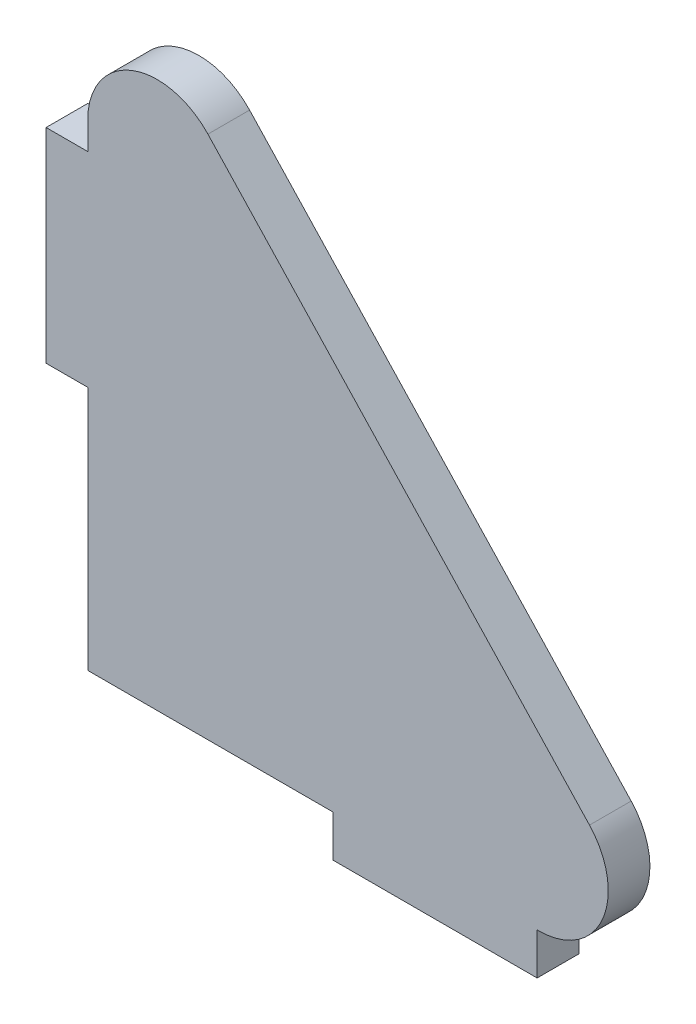
ISO-10303-21;
HEADER;
FILE_DESCRIPTION(('STEP AP214'),'2;1');
FILE_NAME('part.step','',(''),(''),'','','');
FILE_SCHEMA(('AUTOMOTIVE_DESIGN { 1 0 10303 214 1 1 1 1 }'));
ENDSEC;
DATA;
#1=APPLICATION_CONTEXT('core data for automotive mechanical design processes');
#2=APPLICATION_PROTOCOL_DEFINITION('international standard','automotive_design',2000,#1);
#3=PRODUCT_CONTEXT('',#1,'mechanical');
#4=PRODUCT('Part','Part','',(#3));
#5=PRODUCT_RELATED_PRODUCT_CATEGORY('part','',(#4));
#6=PRODUCT_DEFINITION_FORMATION('','',#4);
#7=PRODUCT_DEFINITION_CONTEXT('part definition',#1,'design');
#8=PRODUCT_DEFINITION('design','',#6,#7);
#9=PRODUCT_DEFINITION_SHAPE('','',#8);
#10=(LENGTH_UNIT() NAMED_UNIT(*) SI_UNIT(.MILLI.,.METRE.));
#11=(NAMED_UNIT(*) PLANE_ANGLE_UNIT() SI_UNIT($,.RADIAN.));
#12=(NAMED_UNIT(*) SI_UNIT($,.STERADIAN.) SOLID_ANGLE_UNIT());
#13=UNCERTAINTY_MEASURE_WITH_UNIT(LENGTH_MEASURE(1.E-05),#10,'distance_accuracy_value','');
#14=(GEOMETRIC_REPRESENTATION_CONTEXT(3) GLOBAL_UNCERTAINTY_ASSIGNED_CONTEXT((#13)) GLOBAL_UNIT_ASSIGNED_CONTEXT((#10,
#11,#12)) REPRESENTATION_CONTEXT('',''));
#15=CARTESIAN_POINT('',(0.,0.,0.));
#16=DIRECTION('',(0.,0.,1.));
#17=DIRECTION('',(1.,0.,0.));
#18=AXIS2_PLACEMENT_3D('',#15,#16,#17);
#19=CARTESIAN_POINT('',(3.0847778029221,2.88787709209728,3.));
#20=DIRECTION('',(-0.730021398632119,-0.683424288081133,0.));
#21=DIRECTION('',(0.683424288081133,-0.73002139863212,0.));
#22=AXIS2_PLACEMENT_3D('',#19,#20,#21);
#23=PLANE('',#22);
#24=DIRECTION('',(-0.683424288081134,0.73002139863212,0.));
#25=VECTOR('',#24,1.);
#26=CARTESIAN_POINT('',(3.0847778029221,2.88787709209728,0.));
#27=LINE('',#26,#25);
#28=CARTESIAN_POINT('',(26.0128648989864,-21.6034886696078,0.));
#29=VERTEX_POINT('',#28);
#30=CARTESIAN_POINT('',(-1.45716973811151,7.739502874565,0.));
#31=VERTEX_POINT('',#30);
#32=EDGE_CURVE('E174',#29,#31,#27,.T.);
#33=ORIENTED_EDGE('',*,*,#32,.T.);
#34=DIRECTION('',(0.,0.,-1.));
#35=VECTOR('',#34,1.);
#36=CARTESIAN_POINT('',(-1.45716973811151,7.739502874565,3.));
#37=LINE('',#36,#35);
#38=CARTESIAN_POINT('',(-1.45716973811151,7.739502874565,3.));
#39=VERTEX_POINT('',#38);
#40=EDGE_CURVE('E54',#31,#39,#37,.F.);
#41=ORIENTED_EDGE('',*,*,#40,.T.);
#42=DIRECTION('',(-0.683424288081134,0.73002139863212,0.));
#43=VECTOR('',#42,1.);
#44=CARTESIAN_POINT('',(3.0847778029221,2.88787709209728,3.));
#45=LINE('',#44,#43);
#46=CARTESIAN_POINT('',(26.0128648989864,-21.6034886696078,3.));
#47=VERTEX_POINT('',#46);
#48=EDGE_CURVE('E140',#47,#39,#45,.T.);
#49=ORIENTED_EDGE('',*,*,#48,.F.);
#50=DIRECTION('',(0.,0.,-1.));
#51=VECTOR('',#50,1.);
#52=CARTESIAN_POINT('',(26.0128648989864,-21.6034886696078,3.));
#53=LINE('',#52,#51);
#54=EDGE_CURVE('E220',#47,#29,#53,.T.);
#55=ORIENTED_EDGE('',*,*,#54,.T.);
#56=EDGE_LOOP('',(#33,#41,#49,#55));
#57=FACE_BOUND('',#56,.T.);
#58=ADVANCED_FACE('F33',(#57),#23,.F.);
#59=CARTESIAN_POINT('',(-10.1072767312721,0.,3.));
#60=DIRECTION('',(1.,0.,0.));
#61=DIRECTION('',(0.,1.,0.));
#62=AXIS2_PLACEMENT_3D('',#59,#60,#61);
#63=PLANE('',#62);
#64=DIRECTION('',(0.,-1.,0.));
#65=VECTOR('',#64,1.);
#66=CARTESIAN_POINT('',(-10.1072767312721,0.,3.));
#67=LINE('',#66,#65);
#68=CARTESIAN_POINT('',(-10.1072767312721,4.32238143415934,3.));
#69=VERTEX_POINT('',#68);
#70=CARTESIAN_POINT('',(-10.1072767312721,2.32938988998656,3.));
#71=VERTEX_POINT('',#70);
#72=EDGE_CURVE('E129',#69,#71,#67,.T.);
#73=ORIENTED_EDGE('',*,*,#72,.F.);
#74=DIRECTION('',(0.,0.,-1.));
#75=VECTOR('',#74,1.);
#76=CARTESIAN_POINT('',(-10.1072767312721,4.32238143415934,3.));
#77=LINE('',#76,#75);
#78=CARTESIAN_POINT('',(-10.1072767312721,4.32238143415934,0.));
#79=VERTEX_POINT('',#78);
#80=EDGE_CURVE('E151',#69,#79,#77,.T.);
#81=ORIENTED_EDGE('',*,*,#80,.T.);
#82=DIRECTION('',(0.,-1.,0.));
#83=VECTOR('',#82,1.);
#84=CARTESIAN_POINT('',(-10.1072767312721,0.,0.));
#85=LINE('',#84,#83);
#86=CARTESIAN_POINT('',(-10.1072767312721,2.32938988998656,0.));
#87=VERTEX_POINT('',#86);
#88=EDGE_CURVE('E147',#79,#87,#85,.T.);
#89=ORIENTED_EDGE('',*,*,#88,.T.);
#90=DIRECTION('',(0.,0.,-1.));
#91=VECTOR('',#90,1.);
#92=CARTESIAN_POINT('',(-10.1072767312721,2.32938988998656,3.));
#93=LINE('',#92,#91);
#94=EDGE_CURVE('E144',#71,#87,#93,.T.);
#95=ORIENTED_EDGE('',*,*,#94,.F.);
#96=EDGE_LOOP('',(#73,#81,#89,#95));
#97=FACE_BOUND('',#96,.T.);
#98=ADVANCED_FACE('F145',(#97),#63,.F.);
#99=CARTESIAN_POINT('',(0.,2.32938988998667,3.));
#100=DIRECTION('',(0.,-1.,0.));
#101=DIRECTION('',(1.,0.,0.));
#102=AXIS2_PLACEMENT_3D('',#99,#100,#101);
#103=PLANE('',#102);
#104=DIRECTION('',(-1.,0.,0.));
#105=VECTOR('',#104,1.);
#106=CARTESIAN_POINT('',(0.,2.32938988998667,0.));
#107=LINE('',#106,#105);
#108=CARTESIAN_POINT('',(-13.1072767312725,2.32938988998654,0.));
#109=VERTEX_POINT('',#108);
#110=EDGE_CURVE('E177',#87,#109,#107,.T.);
#111=ORIENTED_EDGE('',*,*,#110,.T.);
#112=DIRECTION('',(0.,0.,-1.));
#113=VECTOR('',#112,1.);
#114=CARTESIAN_POINT('',(-13.1072767312725,2.32938988998654,3.));
#115=LINE('',#114,#113);
#116=CARTESIAN_POINT('',(-13.1072767312725,2.32938988998654,3.));
#117=VERTEX_POINT('',#116);
#118=EDGE_CURVE('E152',#117,#109,#115,.T.);
#119=ORIENTED_EDGE('',*,*,#118,.F.);
#120=DIRECTION('',(-1.,0.,0.));
#121=VECTOR('',#120,1.);
#122=CARTESIAN_POINT('',(0.,2.32938988998667,3.));
#123=LINE('',#122,#121);
#124=EDGE_CURVE('E134',#71,#117,#123,.T.);
#125=ORIENTED_EDGE('',*,*,#124,.F.);
#126=ORIENTED_EDGE('',*,*,#94,.T.);
#127=EDGE_LOOP('',(#111,#119,#125,#126));
#128=FACE_BOUND('',#127,.T.);
#129=ADVANCED_FACE('F154',(#128),#103,.F.);
#130=CARTESIAN_POINT('',(-13.1072767312724,-1.5467687518274E-13,3.));
#131=DIRECTION('',(-1.,0.,0.));
#132=DIRECTION('',(0.,-1.,0.));
#133=AXIS2_PLACEMENT_3D('',#130,#131,#132);
#134=PLANE('',#133);
#135=DIRECTION('',(0.,1.,0.));
#136=VECTOR('',#135,1.);
#137=CARTESIAN_POINT('',(-13.1072767312724,-1.5467687518274E-13,0.));
#138=LINE('',#137,#136);
#139=CARTESIAN_POINT('',(-13.1072767312723,-12.3706101100135,0.));
#140=VERTEX_POINT('',#139);
#141=EDGE_CURVE('E180',#140,#109,#138,.T.);
#142=ORIENTED_EDGE('',*,*,#141,.F.);
#143=DIRECTION('',(0.,0.,-1.));
#144=VECTOR('',#143,1.);
#145=CARTESIAN_POINT('',(-13.1072767312723,-12.3706101100135,3.));
#146=LINE('',#145,#144);
#147=CARTESIAN_POINT('',(-13.1072767312723,-12.3706101100135,3.));
#148=VERTEX_POINT('',#147);
#149=EDGE_CURVE('E212',#148,#140,#146,.T.);
#150=ORIENTED_EDGE('',*,*,#149,.F.);
#151=DIRECTION('',(0.,1.,0.));
#152=VECTOR('',#151,1.);
#153=CARTESIAN_POINT('',(-13.1072767312724,-1.5467687518274E-13,3.));
#154=LINE('',#153,#152);
#155=EDGE_CURVE('E156',#148,#117,#154,.T.);
#156=ORIENTED_EDGE('',*,*,#155,.T.);
#157=ORIENTED_EDGE('',*,*,#118,.T.);
#158=EDGE_LOOP('',(#142,#150,#156,#157));
#159=FACE_BOUND('',#158,.T.);
#160=ADVANCED_FACE('F262',(#159),#134,.T.);
#161=CARTESIAN_POINT('',(1.43063918466641E-13,-12.3706101100133,3.));
#162=DIRECTION('',(0.,-1.,0.));
#163=DIRECTION('',(1.,0.,0.));
#164=AXIS2_PLACEMENT_3D('',#161,#162,#163);
#165=PLANE('',#164);
#166=DIRECTION('',(-1.,0.,0.));
#167=VECTOR('',#166,1.);
#168=CARTESIAN_POINT('',(1.43063918466641E-13,-12.3706101100133,0.));
#169=LINE('',#168,#167);
#170=CARTESIAN_POINT('',(-10.1072767312721,-12.3706101100135,0.));
#171=VERTEX_POINT('',#170);
#172=EDGE_CURVE('E183',#171,#140,#169,.T.);
#173=ORIENTED_EDGE('',*,*,#172,.F.);
#174=DIRECTION('',(0.,0.,-1.));
#175=VECTOR('',#174,1.);
#176=CARTESIAN_POINT('',(-10.1072767312721,-12.3706101100135,3.));
#177=LINE('',#176,#175);
#178=CARTESIAN_POINT('',(-10.1072767312721,-12.3706101100135,3.));
#179=VERTEX_POINT('',#178);
#180=EDGE_CURVE('E210',#179,#171,#177,.T.);
#181=ORIENTED_EDGE('',*,*,#180,.F.);
#182=DIRECTION('',(-1.,0.,0.));
#183=VECTOR('',#182,1.);
#184=CARTESIAN_POINT('',(1.43063918466641E-13,-12.3706101100133,3.));
#185=LINE('',#184,#183);
#186=EDGE_CURVE('E158',#179,#148,#185,.T.);
#187=ORIENTED_EDGE('',*,*,#186,.T.);
#188=ORIENTED_EDGE('',*,*,#149,.T.);
#189=EDGE_LOOP('',(#173,#181,#187,#188));
#190=FACE_BOUND('',#189,.T.);
#191=ADVANCED_FACE('F257',(#190),#165,.T.);
#192=CARTESIAN_POINT('',(-10.1072767312721,-30.0206101100134,0.));
#193=VERTEX_POINT('',#192);
#194=EDGE_CURVE('E178',#171,#193,#85,.T.);
#195=ORIENTED_EDGE('',*,*,#194,.T.);
#196=DIRECTION('',(0.,0.,-1.));
#197=VECTOR('',#196,1.);
#198=CARTESIAN_POINT('',(-10.1072767312721,-30.0206101100134,3.));
#199=LINE('',#198,#197);
#200=CARTESIAN_POINT('',(-10.1072767312721,-30.0206101100134,3.));
#201=VERTEX_POINT('',#200);
#202=EDGE_CURVE('E207',#201,#193,#199,.T.);
#203=ORIENTED_EDGE('',*,*,#202,.F.);
#204=EDGE_CURVE('E142',#179,#201,#67,.T.);
#205=ORIENTED_EDGE('',*,*,#204,.F.);
#206=ORIENTED_EDGE('',*,*,#180,.T.);
#207=EDGE_LOOP('',(#195,#203,#205,#206));
#208=FACE_BOUND('',#207,.T.);
#209=ADVANCED_FACE('F277',(#208),#63,.F.);
#210=CARTESIAN_POINT('',(0.,-30.0206101100134,3.));
#211=DIRECTION('',(0.,1.,0.));
#212=DIRECTION('',(0.,0.,1.));
#213=AXIS2_PLACEMENT_3D('',#210,#211,#212);
#214=PLANE('',#213);
#215=DIRECTION('',(1.,0.,0.));
#216=VECTOR('',#215,1.);
#217=CARTESIAN_POINT('',(0.,-30.0206101100134,0.));
#218=LINE('',#217,#216);
#219=CARTESIAN_POINT('',(7.5427232687279,-30.0206101100134,0.));
#220=VERTEX_POINT('',#219);
#221=EDGE_CURVE('E186',#193,#220,#218,.T.);
#222=ORIENTED_EDGE('',*,*,#221,.T.);
#223=DIRECTION('',(0.,0.,-1.));
#224=VECTOR('',#223,1.);
#225=CARTESIAN_POINT('',(7.5427232687279,-30.0206101100134,3.));
#226=LINE('',#225,#224);
#227=CARTESIAN_POINT('',(7.5427232687279,-30.0206101100134,3.));
#228=VERTEX_POINT('',#227);
#229=EDGE_CURVE('E204',#228,#220,#226,.T.);
#230=ORIENTED_EDGE('',*,*,#229,.F.);
#231=DIRECTION('',(1.,0.,0.));
#232=VECTOR('',#231,1.);
#233=CARTESIAN_POINT('',(0.,-30.0206101100134,3.));
#234=LINE('',#233,#232);
#235=EDGE_CURVE('E164',#201,#228,#234,.T.);
#236=ORIENTED_EDGE('',*,*,#235,.F.);
#237=ORIENTED_EDGE('',*,*,#202,.T.);
#238=EDGE_LOOP('',(#222,#230,#236,#237));
#239=FACE_BOUND('',#238,.T.);
#240=ADVANCED_FACE('F251',(#239),#214,.F.);
#241=CARTESIAN_POINT('',(7.5427232687279,0.,3.));
#242=DIRECTION('',(1.,0.,0.));
#243=DIRECTION('',(0.,0.,-1.));
#244=AXIS2_PLACEMENT_3D('',#241,#242,#243);
#245=PLANE('',#244);
#246=DIRECTION('',(0.,-1.,0.));
#247=VECTOR('',#246,1.);
#248=CARTESIAN_POINT('',(7.5427232687279,0.,0.));
#249=LINE('',#248,#247);
#250=CARTESIAN_POINT('',(7.5427232687279,-33.0206101100134,0.));
#251=VERTEX_POINT('',#250);
#252=EDGE_CURVE('E188',#220,#251,#249,.T.);
#253=ORIENTED_EDGE('',*,*,#252,.T.);
#254=DIRECTION('',(0.,0.,-1.));
#255=VECTOR('',#254,1.);
#256=CARTESIAN_POINT('',(7.5427232687279,-33.0206101100134,3.));
#257=LINE('',#256,#255);
#258=CARTESIAN_POINT('',(7.5427232687279,-33.0206101100134,3.));
#259=VERTEX_POINT('',#258);
#260=EDGE_CURVE('E201',#259,#251,#257,.T.);
#261=ORIENTED_EDGE('',*,*,#260,.F.);
#262=DIRECTION('',(0.,-1.,0.));
#263=VECTOR('',#262,1.);
#264=CARTESIAN_POINT('',(7.5427232687279,0.,3.));
#265=LINE('',#264,#263);
#266=EDGE_CURVE('E166',#228,#259,#265,.T.);
#267=ORIENTED_EDGE('',*,*,#266,.F.);
#268=ORIENTED_EDGE('',*,*,#229,.T.);
#269=EDGE_LOOP('',(#253,#261,#267,#268));
#270=FACE_BOUND('',#269,.T.);
#271=ADVANCED_FACE('F247',(#270),#245,.F.);
#272=CARTESIAN_POINT('',(0.,-33.0206101100134,3.));
#273=DIRECTION('',(0.,1.,0.));
#274=DIRECTION('',(0.,0.,1.));
#275=AXIS2_PLACEMENT_3D('',#272,#273,#274);
#276=PLANE('',#275);
#277=DIRECTION('',(1.,0.,0.));
#278=VECTOR('',#277,1.);
#279=CARTESIAN_POINT('',(0.,-33.0206101100134,0.));
#280=LINE('',#279,#278);
#281=CARTESIAN_POINT('',(22.2427232687279,-33.0206101100134,0.));
#282=VERTEX_POINT('',#281);
#283=EDGE_CURVE('E191',#251,#282,#280,.T.);
#284=ORIENTED_EDGE('',*,*,#283,.T.);
#285=DIRECTION('',(0.,0.,-1.));
#286=VECTOR('',#285,1.);
#287=CARTESIAN_POINT('',(22.2427232687279,-33.0206101100134,3.));
#288=LINE('',#287,#286);
#289=CARTESIAN_POINT('',(22.2427232687279,-33.0206101100134,3.));
#290=VERTEX_POINT('',#289);
#291=EDGE_CURVE('E199',#290,#282,#288,.T.);
#292=ORIENTED_EDGE('',*,*,#291,.F.);
#293=DIRECTION('',(1.,0.,0.));
#294=VECTOR('',#293,1.);
#295=CARTESIAN_POINT('',(0.,-33.0206101100134,3.));
#296=LINE('',#295,#294);
#297=EDGE_CURVE('E169',#259,#290,#296,.T.);
#298=ORIENTED_EDGE('',*,*,#297,.F.);
#299=ORIENTED_EDGE('',*,*,#260,.T.);
#300=EDGE_LOOP('',(#284,#292,#298,#299));
#301=FACE_BOUND('',#300,.T.);
#302=ADVANCED_FACE('F242',(#301),#276,.F.);
#303=CARTESIAN_POINT('',(22.2427232687277,1.02893264597114E-13,3.));
#304=DIRECTION('',(1.,0.,0.));
#305=DIRECTION('',(0.,1.,0.));
#306=AXIS2_PLACEMENT_3D('',#303,#304,#305);
#307=PLANE('',#306);
#308=DIRECTION('',(0.,-1.,0.));
#309=VECTOR('',#308,1.);
#310=CARTESIAN_POINT('',(22.2427232687277,1.02893264597114E-13,0.));
#311=LINE('',#310,#309);
#312=CARTESIAN_POINT('',(22.2427232687279,-30.0206101100134,0.));
#313=VERTEX_POINT('',#312);
#314=EDGE_CURVE('E194',#313,#282,#311,.T.);
#315=ORIENTED_EDGE('',*,*,#314,.F.);
#316=DIRECTION('',(0.,0.,-1.));
#317=VECTOR('',#316,1.);
#318=CARTESIAN_POINT('',(22.2427232687279,-30.0206101100134,3.));
#319=LINE('',#318,#317);
#320=CARTESIAN_POINT('',(22.2427232687279,-30.0206101100134,3.));
#321=VERTEX_POINT('',#320);
#322=EDGE_CURVE('E197',#321,#313,#319,.T.);
#323=ORIENTED_EDGE('',*,*,#322,.F.);
#324=DIRECTION('',(0.,-1.,0.));
#325=VECTOR('',#324,1.);
#326=CARTESIAN_POINT('',(22.2427232687277,1.02893264597114E-13,3.));
#327=LINE('',#326,#325);
#328=EDGE_CURVE('E171',#321,#290,#327,.T.);
#329=ORIENTED_EDGE('',*,*,#328,.T.);
#330=ORIENTED_EDGE('',*,*,#291,.T.);
#331=EDGE_LOOP('',(#315,#323,#329,#330));
#332=FACE_BOUND('',#331,.T.);
#333=ADVANCED_FACE('F236',(#332),#307,.T.);
#334=CARTESIAN_POINT('',(22.3627579058258,-30.0206101100134,0.));
#335=VERTEX_POINT('',#334);
#336=EDGE_CURVE('E189',#313,#335,#218,.T.);
#337=ORIENTED_EDGE('',*,*,#336,.T.);
#338=DIRECTION('',(0.,0.,-1.));
#339=VECTOR('',#338,1.);
#340=CARTESIAN_POINT('',(22.3627579058258,-30.0206101100134,3.));
#341=LINE('',#340,#339);
#342=CARTESIAN_POINT('',(22.3627579058258,-30.0206101100134,3.));
#343=VERTEX_POINT('',#342);
#344=EDGE_CURVE('E11',#335,#343,#341,.F.);
#345=ORIENTED_EDGE('',*,*,#344,.T.);
#346=EDGE_CURVE('E167',#321,#343,#234,.T.);
#347=ORIENTED_EDGE('',*,*,#346,.F.);
#348=ORIENTED_EDGE('',*,*,#322,.T.);
#349=EDGE_LOOP('',(#337,#345,#347,#348));
#350=FACE_BOUND('',#349,.T.);
#351=ADVANCED_FACE('F234',(#350),#214,.F.);
#352=CARTESIAN_POINT('',(0.,0.,3.));
#353=DIRECTION('',(0.,0.,1.));
#354=DIRECTION('',(1.,0.,0.));
#355=AXIS2_PLACEMENT_3D('',#352,#353,#354);
#356=PLANE('',#355);
#357=ORIENTED_EDGE('',*,*,#48,.T.);
#358=CARTESIAN_POINT('',(-5.10727673127211,4.32238143415934,3.));
#359=DIRECTION('',(0.,0.,1.));
#360=DIRECTION('',(1.,0.,0.));
#361=AXIS2_PLACEMENT_3D('',#358,#359,#360);
#362=CIRCLE('',#361,5.);
#363=EDGE_CURVE('E41',#39,#69,#362,.T.);
#364=ORIENTED_EDGE('',*,*,#363,.T.);
#365=ORIENTED_EDGE('',*,*,#72,.T.);
#366=ORIENTED_EDGE('',*,*,#124,.T.);
#367=ORIENTED_EDGE('',*,*,#155,.F.);
#368=ORIENTED_EDGE('',*,*,#186,.F.);
#369=ORIENTED_EDGE('',*,*,#204,.T.);
#370=ORIENTED_EDGE('',*,*,#235,.T.);
#371=ORIENTED_EDGE('',*,*,#266,.T.);
#372=ORIENTED_EDGE('',*,*,#297,.T.);
#373=ORIENTED_EDGE('',*,*,#328,.F.);
#374=ORIENTED_EDGE('',*,*,#346,.T.);
#375=CARTESIAN_POINT('',(22.3627579058258,-25.0206101100134,3.));
#376=DIRECTION('',(0.,0.,1.));
#377=DIRECTION('',(1.,0.,0.));
#378=AXIS2_PLACEMENT_3D('',#375,#376,#377);
#379=CIRCLE('',#378,5.);
#380=EDGE_CURVE('E224',#343,#47,#379,.T.);
#381=ORIENTED_EDGE('',*,*,#380,.T.);
#382=EDGE_LOOP('',(#357,#364,#365,#366,#367,#368,#369,#370,#371,#372,#373,#374,#381));
#383=FACE_BOUND('',#382,.T.);
#384=ADVANCED_FACE('F131',(#383),#356,.T.);
#385=CARTESIAN_POINT('',(0.,0.,0.));
#386=DIRECTION('',(0.,0.,1.));
#387=DIRECTION('',(1.,0.,0.));
#388=AXIS2_PLACEMENT_3D('',#385,#386,#387);
#389=PLANE('',#388);
#390=ORIENTED_EDGE('',*,*,#88,.F.);
#391=CARTESIAN_POINT('',(-5.10727673127211,4.32238143415934,0.));
#392=DIRECTION('',(0.,0.,1.));
#393=DIRECTION('',(1.,0.,0.));
#394=AXIS2_PLACEMENT_3D('',#391,#392,#393);
#395=CIRCLE('',#394,5.);
#396=EDGE_CURVE('E218',#79,#31,#395,.F.);
#397=ORIENTED_EDGE('',*,*,#396,.T.);
#398=ORIENTED_EDGE('',*,*,#32,.F.);
#399=CARTESIAN_POINT('',(22.3627579058258,-25.0206101100134,0.));
#400=DIRECTION('',(0.,0.,1.));
#401=DIRECTION('',(1.,0.,0.));
#402=AXIS2_PLACEMENT_3D('',#399,#400,#401);
#403=CIRCLE('',#402,5.);
#404=EDGE_CURVE('E216',#29,#335,#403,.F.);
#405=ORIENTED_EDGE('',*,*,#404,.T.);
#406=ORIENTED_EDGE('',*,*,#336,.F.);
#407=ORIENTED_EDGE('',*,*,#314,.T.);
#408=ORIENTED_EDGE('',*,*,#283,.F.);
#409=ORIENTED_EDGE('',*,*,#252,.F.);
#410=ORIENTED_EDGE('',*,*,#221,.F.);
#411=ORIENTED_EDGE('',*,*,#194,.F.);
#412=ORIENTED_EDGE('',*,*,#172,.T.);
#413=ORIENTED_EDGE('',*,*,#141,.T.);
#414=ORIENTED_EDGE('',*,*,#110,.F.);
#415=EDGE_LOOP('',(#390,#397,#398,#405,#406,#407,#408,#409,#410,#411,#412,#413,#414));
#416=FACE_BOUND('',#415,.T.);
#417=ADVANCED_FACE('F232',(#416),#389,.F.);
#418=CARTESIAN_POINT('',(-5.10727673127211,4.32238143415934,3.));
#419=DIRECTION('',(0.,0.,-1.));
#420=DIRECTION('',(-1.,0.,0.));
#421=AXIS2_PLACEMENT_3D('',#418,#419,#420);
#422=CYLINDRICAL_SURFACE('',#421,5.);
#423=ORIENTED_EDGE('',*,*,#363,.F.);
#424=ORIENTED_EDGE('',*,*,#40,.F.);
#425=ORIENTED_EDGE('',*,*,#396,.F.);
#426=ORIENTED_EDGE('',*,*,#80,.F.);
#427=EDGE_LOOP('',(#423,#424,#425,#426));
#428=FACE_BOUND('',#427,.T.);
#429=ADVANCED_FACE('F264',(#428),#422,.T.);
#430=CARTESIAN_POINT('',(22.3627579058258,-25.0206101100134,3.));
#431=DIRECTION('',(0.,0.,-1.));
#432=DIRECTION('',(-1.,0.,0.));
#433=AXIS2_PLACEMENT_3D('',#430,#431,#432);
#434=CYLINDRICAL_SURFACE('',#433,5.);
#435=ORIENTED_EDGE('',*,*,#380,.F.);
#436=ORIENTED_EDGE('',*,*,#344,.F.);
#437=ORIENTED_EDGE('',*,*,#404,.F.);
#438=ORIENTED_EDGE('',*,*,#54,.F.);
#439=EDGE_LOOP('',(#435,#436,#437,#438));
#440=FACE_BOUND('',#439,.T.);
#441=ADVANCED_FACE('F35',(#440),#434,.T.);
#442=CLOSED_SHELL('',(#58,#98,#129,#160,#191,#209,#240,#271,#302,#333,#351,#384,#417,#429,#441));
#443=MANIFOLD_SOLID_BREP('B2',#442);
#444=ADVANCED_BREP_SHAPE_REPRESENTATION('',(#18,#443),#14);
#445=SHAPE_DEFINITION_REPRESENTATION(#9,#444);
ENDSEC;
END-ISO-10303-21;
